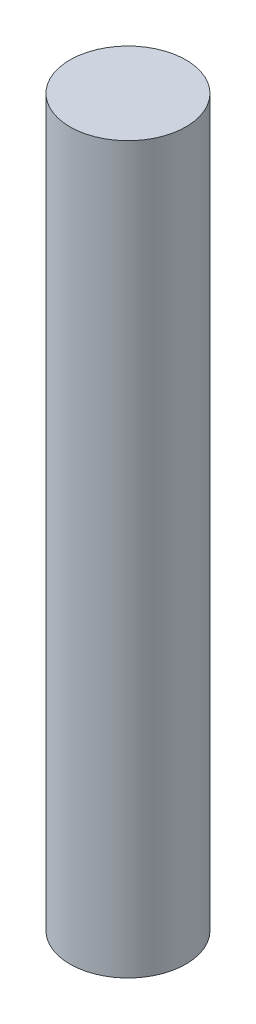
ISO-10303-21;
HEADER;
FILE_DESCRIPTION(('STEP AP214'),'2;1');
FILE_NAME('part.step','',(''),(''),'','','');
FILE_SCHEMA(('AUTOMOTIVE_DESIGN { 1 0 10303 214 1 1 1 1 }'));
ENDSEC;
DATA;
#1=APPLICATION_CONTEXT('core data for automotive mechanical design processes');
#2=APPLICATION_PROTOCOL_DEFINITION('international standard','automotive_design',2000,#1);
#3=PRODUCT_CONTEXT('',#1,'mechanical');
#4=PRODUCT('Part','Part','',(#3));
#5=PRODUCT_RELATED_PRODUCT_CATEGORY('part','',(#4));
#6=PRODUCT_DEFINITION_FORMATION('','',#4);
#7=PRODUCT_DEFINITION_CONTEXT('part definition',#1,'design');
#8=PRODUCT_DEFINITION('design','',#6,#7);
#9=PRODUCT_DEFINITION_SHAPE('','',#8);
#10=(LENGTH_UNIT() NAMED_UNIT(*) SI_UNIT(.MILLI.,.METRE.));
#11=(NAMED_UNIT(*) PLANE_ANGLE_UNIT() SI_UNIT($,.RADIAN.));
#12=(NAMED_UNIT(*) SI_UNIT($,.STERADIAN.) SOLID_ANGLE_UNIT());
#13=UNCERTAINTY_MEASURE_WITH_UNIT(LENGTH_MEASURE(1.E-05),#10,'distance_accuracy_value','');
#14=(GEOMETRIC_REPRESENTATION_CONTEXT(3) GLOBAL_UNCERTAINTY_ASSIGNED_CONTEXT((#13)) GLOBAL_UNIT_ASSIGNED_CONTEXT((#10,
#11,#12)) REPRESENTATION_CONTEXT('',''));
#15=CARTESIAN_POINT('',(0.,0.,0.));
#16=DIRECTION('',(0.,0.,1.));
#17=DIRECTION('',(1.,0.,0.));
#18=AXIS2_PLACEMENT_3D('',#15,#16,#17);
#19=CARTESIAN_POINT('',(0.,150.,0.));
#20=DIRECTION('',(0.,-1.,0.));
#21=DIRECTION('',(0.,0.,-1.));
#22=AXIS2_PLACEMENT_3D('',#19,#20,#21);
#23=CYLINDRICAL_SURFACE('',#22,12.);
#24=CARTESIAN_POINT('',(0.,150.,0.));
#25=DIRECTION('',(0.,1.,0.));
#26=DIRECTION('',(0.,0.,1.));
#27=AXIS2_PLACEMENT_3D('',#24,#25,#26);
#28=CIRCLE('',#27,12.);
#29=CARTESIAN_POINT('',(0.,150.,12.));
#30=VERTEX_POINT('',#29);
#31=EDGE_CURVE('E10',#30,#30,#28,.T.);
#32=ORIENTED_EDGE('',*,*,#31,.F.);
#33=EDGE_LOOP('',(#32));
#34=FACE_BOUND('',#33,.T.);
#35=CARTESIAN_POINT('',(0.,0.,0.));
#36=DIRECTION('',(0.,1.,0.));
#37=DIRECTION('',(0.,0.,1.));
#38=AXIS2_PLACEMENT_3D('',#35,#36,#37);
#39=CIRCLE('',#38,12.);
#40=CARTESIAN_POINT('',(0.,0.,12.));
#41=VERTEX_POINT('',#40);
#42=EDGE_CURVE('E36',#41,#41,#39,.T.);
#43=ORIENTED_EDGE('',*,*,#42,.T.);
#44=EDGE_LOOP('',(#43));
#45=FACE_BOUND('',#44,.T.);
#46=ADVANCED_FACE('F33',(#34,#45),#23,.T.);
#47=CARTESIAN_POINT('',(0.,150.,0.));
#48=DIRECTION('',(0.,1.,0.));
#49=DIRECTION('',(0.,0.,1.));
#50=AXIS2_PLACEMENT_3D('',#47,#48,#49);
#51=PLANE('',#50);
#52=ORIENTED_EDGE('',*,*,#31,.T.);
#53=EDGE_LOOP('',(#52));
#54=FACE_BOUND('',#53,.T.);
#55=ADVANCED_FACE('F48',(#54),#51,.T.);
#56=CARTESIAN_POINT('',(0.,0.,0.));
#57=DIRECTION('',(0.,1.,0.));
#58=DIRECTION('',(0.,0.,1.));
#59=AXIS2_PLACEMENT_3D('',#56,#57,#58);
#60=PLANE('',#59);
#61=ORIENTED_EDGE('',*,*,#42,.F.);
#62=EDGE_LOOP('',(#61));
#63=FACE_BOUND('',#62,.T.);
#64=ADVANCED_FACE('F46',(#63),#60,.F.);
#65=CLOSED_SHELL('',(#46,#55,#64));
#66=MANIFOLD_SOLID_BREP('B2',#65);
#67=ADVANCED_BREP_SHAPE_REPRESENTATION('',(#18,#66),#14);
#68=SHAPE_DEFINITION_REPRESENTATION(#9,#67);
ENDSEC;
END-ISO-10303-21;
